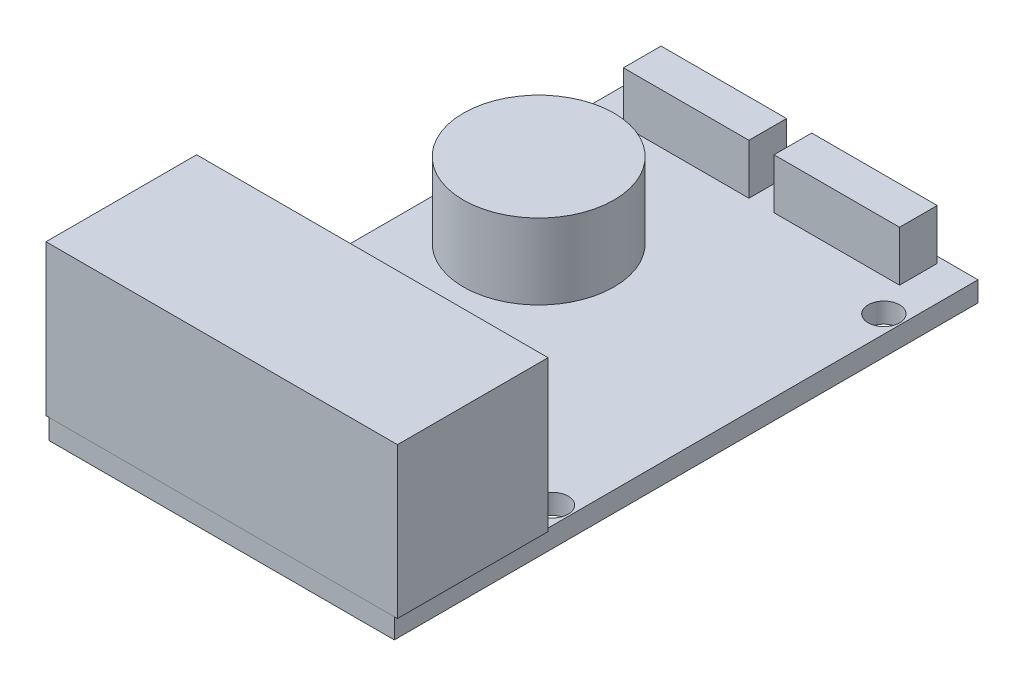
ISO-10303-21;
HEADER;
FILE_DESCRIPTION(('STEP AP214'),'2;1');
FILE_NAME('part.step','',(''),(''),'','','');
FILE_SCHEMA(('AUTOMOTIVE_DESIGN { 1 0 10303 214 1 1 1 1 }'));
ENDSEC;
DATA;
#1=APPLICATION_CONTEXT('core data for automotive mechanical design processes');
#2=APPLICATION_PROTOCOL_DEFINITION('international standard','automotive_design',2000,#1);
#3=PRODUCT_CONTEXT('',#1,'mechanical');
#4=PRODUCT('Part','Part','',(#3));
#5=PRODUCT_RELATED_PRODUCT_CATEGORY('part','',(#4));
#6=PRODUCT_DEFINITION_FORMATION('','',#4);
#7=PRODUCT_DEFINITION_CONTEXT('part definition',#1,'design');
#8=PRODUCT_DEFINITION('design','',#6,#7);
#9=PRODUCT_DEFINITION_SHAPE('','',#8);
#10=(LENGTH_UNIT() NAMED_UNIT(*) SI_UNIT(.MILLI.,.METRE.));
#11=(NAMED_UNIT(*) PLANE_ANGLE_UNIT() SI_UNIT($,.RADIAN.));
#12=(NAMED_UNIT(*) SI_UNIT($,.STERADIAN.) SOLID_ANGLE_UNIT());
#13=UNCERTAINTY_MEASURE_WITH_UNIT(LENGTH_MEASURE(1.E-05),#10,'distance_accuracy_value','');
#14=(GEOMETRIC_REPRESENTATION_CONTEXT(3) GLOBAL_UNCERTAINTY_ASSIGNED_CONTEXT((#13)) GLOBAL_UNIT_ASSIGNED_CONTEXT((#10,
#11,#12)) REPRESENTATION_CONTEXT('',''));
#15=CARTESIAN_POINT('',(0.,0.,0.));
#16=DIRECTION('',(0.,0.,1.));
#17=DIRECTION('',(1.,0.,0.));
#18=AXIS2_PLACEMENT_3D('',#15,#16,#17);
#19=CARTESIAN_POINT('',(-14.,13.6,11.25));
#20=DIRECTION('',(-1.,0.,0.));
#21=DIRECTION('',(0.,-1.,0.));
#22=AXIS2_PLACEMENT_3D('',#19,#20,#21);
#23=PLANE('',#22);
#24=DIRECTION('',(0.,-1.,0.));
#25=VECTOR('',#24,1.);
#26=CARTESIAN_POINT('',(-14.,13.6,23.25));
#27=LINE('',#26,#25);
#28=CARTESIAN_POINT('',(-14.,13.6,23.25));
#29=VERTEX_POINT('',#28);
#30=CARTESIAN_POINT('',(-14.,1.6,23.25));
#31=VERTEX_POINT('',#30);
#32=EDGE_CURVE('E122',#29,#31,#27,.T.);
#33=ORIENTED_EDGE('',*,*,#32,.F.);
#34=DIRECTION('',(0.,0.,1.));
#35=VECTOR('',#34,1.);
#36=CARTESIAN_POINT('',(-14.,13.6,11.25));
#37=LINE('',#36,#35);
#38=CARTESIAN_POINT('',(-14.,13.6,11.25));
#39=VERTEX_POINT('',#38);
#40=EDGE_CURVE('E12',#39,#29,#37,.T.);
#41=ORIENTED_EDGE('',*,*,#40,.F.);
#42=DIRECTION('',(0.,-1.,0.));
#43=VECTOR('',#42,1.);
#44=CARTESIAN_POINT('',(-14.,13.6,11.25));
#45=LINE('',#44,#43);
#46=CARTESIAN_POINT('',(-14.,1.6,11.25));
#47=VERTEX_POINT('',#46);
#48=EDGE_CURVE('E114',#39,#47,#45,.T.);
#49=ORIENTED_EDGE('',*,*,#48,.T.);
#50=DIRECTION('',(0.,0.,1.));
#51=VECTOR('',#50,1.);
#52=CARTESIAN_POINT('',(-14.,1.6,11.25));
#53=LINE('',#52,#51);
#54=EDGE_CURVE('E55',#47,#31,#53,.T.);
#55=ORIENTED_EDGE('',*,*,#54,.T.);
#56=EDGE_LOOP('',(#33,#41,#49,#55));
#57=FACE_BOUND('',#56,.T.);
#58=ADVANCED_FACE('F52',(#57),#23,.T.);
#59=CARTESIAN_POINT('',(-14.,13.6,11.25));
#60=DIRECTION('',(0.,1.,0.));
#61=DIRECTION('',(0.,0.,1.));
#62=AXIS2_PLACEMENT_3D('',#59,#60,#61);
#63=PLANE('',#62);
#64=DIRECTION('',(-1.,0.,0.));
#65=VECTOR('',#64,1.);
#66=CARTESIAN_POINT('',(-14.,13.6,23.25));
#67=LINE('',#66,#65);
#68=CARTESIAN_POINT('',(14.,13.6,23.25));
#69=VERTEX_POINT('',#68);
#70=EDGE_CURVE('E117',#69,#29,#67,.T.);
#71=ORIENTED_EDGE('',*,*,#70,.F.);
#72=DIRECTION('',(0.,0.,1.));
#73=VECTOR('',#72,1.);
#74=CARTESIAN_POINT('',(14.,13.6,11.25));
#75=LINE('',#74,#73);
#76=CARTESIAN_POINT('',(14.,13.6,11.25));
#77=VERTEX_POINT('',#76);
#78=EDGE_CURVE('E62',#77,#69,#75,.T.);
#79=ORIENTED_EDGE('',*,*,#78,.F.);
#80=DIRECTION('',(-1.,0.,0.));
#81=VECTOR('',#80,1.);
#82=CARTESIAN_POINT('',(-14.,13.6,11.25));
#83=LINE('',#82,#81);
#84=EDGE_CURVE('E109',#77,#39,#83,.T.);
#85=ORIENTED_EDGE('',*,*,#84,.T.);
#86=ORIENTED_EDGE('',*,*,#40,.T.);
#87=EDGE_LOOP('',(#71,#79,#85,#86));
#88=FACE_BOUND('',#87,.T.);
#89=ADVANCED_FACE('F138',(#88),#63,.T.);
#90=CARTESIAN_POINT('',(14.,13.6,11.25));
#91=DIRECTION('',(1.,0.,0.));
#92=DIRECTION('',(0.,1.,0.));
#93=AXIS2_PLACEMENT_3D('',#90,#91,#92);
#94=PLANE('',#93);
#95=DIRECTION('',(0.,1.,0.));
#96=VECTOR('',#95,1.);
#97=CARTESIAN_POINT('',(14.,13.6,23.25));
#98=LINE('',#97,#96);
#99=CARTESIAN_POINT('',(14.,1.6,23.25));
#100=VERTEX_POINT('',#99);
#101=EDGE_CURVE('E103',#100,#69,#98,.T.);
#102=ORIENTED_EDGE('',*,*,#101,.F.);
#103=DIRECTION('',(0.,0.,1.));
#104=VECTOR('',#103,1.);
#105=CARTESIAN_POINT('',(14.,1.6,11.25));
#106=LINE('',#105,#104);
#107=CARTESIAN_POINT('',(14.,1.6,11.25));
#108=VERTEX_POINT('',#107);
#109=EDGE_CURVE('E98',#108,#100,#106,.T.);
#110=ORIENTED_EDGE('',*,*,#109,.F.);
#111=DIRECTION('',(0.,1.,0.));
#112=VECTOR('',#111,1.);
#113=CARTESIAN_POINT('',(14.,13.6,11.25));
#114=LINE('',#113,#112);
#115=EDGE_CURVE('E101',#108,#77,#114,.T.);
#116=ORIENTED_EDGE('',*,*,#115,.T.);
#117=ORIENTED_EDGE('',*,*,#78,.T.);
#118=EDGE_LOOP('',(#102,#110,#116,#117));
#119=FACE_BOUND('',#118,.T.);
#120=ADVANCED_FACE('F100',(#119),#94,.T.);
#121=CARTESIAN_POINT('',(-14.,1.6,11.25));
#122=DIRECTION('',(0.,-1.,0.));
#123=DIRECTION('',(0.,0.,-1.));
#124=AXIS2_PLACEMENT_3D('',#121,#122,#123);
#125=PLANE('',#124);
#126=DIRECTION('',(1.,0.,0.));
#127=VECTOR('',#126,1.);
#128=CARTESIAN_POINT('',(-14.,1.6,23.25));
#129=LINE('',#128,#127);
#130=EDGE_CURVE('E126',#31,#100,#129,.T.);
#131=ORIENTED_EDGE('',*,*,#130,.F.);
#132=ORIENTED_EDGE('',*,*,#54,.F.);
#133=DIRECTION('',(1.,0.,0.));
#134=VECTOR('',#133,1.);
#135=CARTESIAN_POINT('',(-14.,1.6,11.25));
#136=LINE('',#135,#134);
#137=EDGE_CURVE('E108',#47,#108,#136,.T.);
#138=ORIENTED_EDGE('',*,*,#137,.T.);
#139=ORIENTED_EDGE('',*,*,#109,.T.);
#140=EDGE_LOOP('',(#131,#132,#138,#139));
#141=FACE_BOUND('',#140,.T.);
#142=ADVANCED_FACE('F112',(#141),#125,.T.);
#143=CARTESIAN_POINT('',(0.,0.,11.25));
#144=DIRECTION('',(0.,0.,1.));
#145=DIRECTION('',(1.,0.,0.));
#146=AXIS2_PLACEMENT_3D('',#143,#144,#145);
#147=PLANE('',#146);
#148=ORIENTED_EDGE('',*,*,#48,.F.);
#149=ORIENTED_EDGE('',*,*,#84,.F.);
#150=ORIENTED_EDGE('',*,*,#115,.F.);
#151=ORIENTED_EDGE('',*,*,#137,.F.);
#152=EDGE_LOOP('',(#148,#149,#150,#151));
#153=FACE_BOUND('',#152,.T.);
#154=ADVANCED_FACE('F107',(#153),#147,.F.);
#155=CARTESIAN_POINT('',(0.,0.,23.25));
#156=DIRECTION('',(0.,0.,1.));
#157=DIRECTION('',(1.,0.,0.));
#158=AXIS2_PLACEMENT_3D('',#155,#156,#157);
#159=PLANE('',#158);
#160=ORIENTED_EDGE('',*,*,#32,.T.);
#161=ORIENTED_EDGE('',*,*,#130,.T.);
#162=ORIENTED_EDGE('',*,*,#101,.T.);
#163=ORIENTED_EDGE('',*,*,#70,.T.);
#164=EDGE_LOOP('',(#160,#161,#162,#163));
#165=FACE_BOUND('',#164,.T.);
#166=ADVANCED_FACE('F137',(#165),#159,.T.);
#167=CLOSED_SHELL('',(#58,#89,#120,#142,#154,#166));
#168=MANIFOLD_SOLID_BREP('B2',#167);
#169=CARTESIAN_POINT('',(0.,1.6,0.));
#170=DIRECTION('',(0.,1.,0.));
#171=DIRECTION('',(0.,0.,1.));
#172=AXIS2_PLACEMENT_3D('',#169,#170,#171);
#173=PLANE('',#172);
#174=CARTESIAN_POINT('',(-6.25,1.6,-8.25));
#175=DIRECTION('',(0.,1.,0.));
#176=DIRECTION('',(0.,0.,1.));
#177=AXIS2_PLACEMENT_3D('',#174,#175,#176);
#178=CIRCLE('',#177,6.);
#179=CARTESIAN_POINT('',(-6.25,1.6,-2.25));
#180=VERTEX_POINT('',#179);
#181=EDGE_CURVE('E347',#180,#180,#178,.T.);
#182=ORIENTED_EDGE('',*,*,#181,.F.);
#183=EDGE_LOOP('',(#182));
#184=FACE_BOUND('',#183,.T.);
#185=CARTESIAN_POINT('',(12.35,1.6,-17.15));
#186=DIRECTION('',(0.,1.,0.));
#187=DIRECTION('',(0.,0.,-1.));
#188=AXIS2_PLACEMENT_3D('',#185,#186,#187);
#189=CIRCLE('',#188,1.25);
#190=CARTESIAN_POINT('',(12.35,1.6,-18.4));
#191=VERTEX_POINT('',#190);
#192=EDGE_CURVE('E367',#191,#191,#189,.T.);
#193=ORIENTED_EDGE('',*,*,#192,.F.);
#194=EDGE_LOOP('',(#193));
#195=FACE_BOUND('',#194,.T.);
#196=CARTESIAN_POINT('',(12.35,1.6,9.24999999999997));
#197=DIRECTION('',(0.,1.,0.));
#198=DIRECTION('',(0.,0.,-1.));
#199=AXIS2_PLACEMENT_3D('',#196,#197,#198);
#200=CIRCLE('',#199,1.25);
#201=CARTESIAN_POINT('',(12.35,1.6,7.99999999999997));
#202=VERTEX_POINT('',#201);
#203=EDGE_CURVE('E361',#202,#202,#200,.T.);
#204=ORIENTED_EDGE('',*,*,#203,.F.);
#205=EDGE_LOOP('',(#204));
#206=FACE_BOUND('',#205,.T.);
#207=CARTESIAN_POINT('',(-12.35,1.6,9.25));
#208=DIRECTION('',(0.,1.,0.));
#209=DIRECTION('',(0.,0.,1.));
#210=AXIS2_PLACEMENT_3D('',#207,#208,#209);
#211=CIRCLE('',#210,1.25);
#212=CARTESIAN_POINT('',(-12.35,1.6,10.5));
#213=VERTEX_POINT('',#212);
#214=EDGE_CURVE('E354',#213,#213,#211,.T.);
#215=ORIENTED_EDGE('',*,*,#214,.F.);
#216=EDGE_LOOP('',(#215));
#217=FACE_BOUND('',#216,.T.);
#218=CARTESIAN_POINT('',(-12.35,1.6,-17.15));
#219=DIRECTION('',(0.,1.,0.));
#220=DIRECTION('',(0.,0.,1.));
#221=AXIS2_PLACEMENT_3D('',#218,#219,#220);
#222=CIRCLE('',#221,1.25);
#223=CARTESIAN_POINT('',(-12.35,1.6,-15.9));
#224=VERTEX_POINT('',#223);
#225=EDGE_CURVE('E357',#224,#224,#222,.T.);
#226=ORIENTED_EDGE('',*,*,#225,.F.);
#227=EDGE_LOOP('',(#226));
#228=FACE_BOUND('',#227,.T.);
#229=DIRECTION('',(0.,0.,1.));
#230=VECTOR('',#229,1.);
#231=CARTESIAN_POINT('',(-13.75,1.6,-23.25));
#232=LINE('',#231,#230);
#233=CARTESIAN_POINT('',(-13.75,1.6,-23.25));
#234=VERTEX_POINT('',#233);
#235=CARTESIAN_POINT('',(-13.75,1.6,23.25));
#236=VERTEX_POINT('',#235);
#237=EDGE_CURVE('E378',#234,#236,#232,.T.);
#238=ORIENTED_EDGE('',*,*,#237,.T.);
#239=DIRECTION('',(1.,0.,0.));
#240=VECTOR('',#239,1.);
#241=CARTESIAN_POINT('',(-13.75,1.6,23.25));
#242=LINE('',#241,#240);
#243=CARTESIAN_POINT('',(13.75,1.6,23.25));
#244=VERTEX_POINT('',#243);
#245=EDGE_CURVE('E381',#236,#244,#242,.T.);
#246=ORIENTED_EDGE('',*,*,#245,.T.);
#247=DIRECTION('',(0.,0.,-1.));
#248=VECTOR('',#247,1.);
#249=CARTESIAN_POINT('',(13.75,1.6,-23.25));
#250=LINE('',#249,#248);
#251=CARTESIAN_POINT('',(13.75,1.6,-23.25));
#252=VERTEX_POINT('',#251);
#253=EDGE_CURVE('E384',#244,#252,#250,.T.);
#254=ORIENTED_EDGE('',*,*,#253,.T.);
#255=DIRECTION('',(-1.,0.,0.));
#256=VECTOR('',#255,1.);
#257=CARTESIAN_POINT('',(-13.75,1.6,-23.25));
#258=LINE('',#257,#256);
#259=EDGE_CURVE('E386',#252,#234,#258,.T.);
#260=ORIENTED_EDGE('',*,*,#259,.T.);
#261=EDGE_LOOP('',(#238,#246,#254,#260));
#262=FACE_BOUND('',#261,.T.);
#263=DIRECTION('',(1.,0.,0.));
#264=VECTOR('',#263,1.);
#265=CARTESIAN_POINT('',(-11.,1.6,-19.75));
#266=LINE('',#265,#264);
#267=CARTESIAN_POINT('',(-11.,1.6,-19.75));
#268=VERTEX_POINT('',#267);
#269=CARTESIAN_POINT('',(-1.,1.6,-19.75));
#270=VERTEX_POINT('',#269);
#271=EDGE_CURVE('E313',#268,#270,#266,.T.);
#272=ORIENTED_EDGE('',*,*,#271,.F.);
#273=DIRECTION('',(0.,0.,1.));
#274=VECTOR('',#273,1.);
#275=CARTESIAN_POINT('',(-11.,1.6,-22.75));
#276=LINE('',#275,#274);
#277=CARTESIAN_POINT('',(-11.,1.6,-22.75));
#278=VERTEX_POINT('',#277);
#279=EDGE_CURVE('E310',#278,#268,#276,.T.);
#280=ORIENTED_EDGE('',*,*,#279,.F.);
#281=DIRECTION('',(-1.,0.,0.));
#282=VECTOR('',#281,1.);
#283=CARTESIAN_POINT('',(-11.,1.6,-22.75));
#284=LINE('',#283,#282);
#285=CARTESIAN_POINT('',(-0.999999999999999,1.6,-22.75));
#286=VERTEX_POINT('',#285);
#287=EDGE_CURVE('E328',#286,#278,#284,.T.);
#288=ORIENTED_EDGE('',*,*,#287,.F.);
#289=DIRECTION('',(0.,0.,-1.));
#290=VECTOR('',#289,1.);
#291=CARTESIAN_POINT('',(-0.999999999999999,1.6,-22.75));
#292=LINE('',#291,#290);
#293=EDGE_CURVE('E336',#270,#286,#292,.T.);
#294=ORIENTED_EDGE('',*,*,#293,.F.);
#295=EDGE_LOOP('',(#272,#280,#288,#294));
#296=FACE_BOUND('',#295,.T.);
#297=DIRECTION('',(-1.,0.,0.));
#298=VECTOR('',#297,1.);
#299=CARTESIAN_POINT('',(11.,1.6,-22.75));
#300=LINE('',#299,#298);
#301=CARTESIAN_POINT('',(11.,1.6,-22.75));
#302=VERTEX_POINT('',#301);
#303=CARTESIAN_POINT('',(0.999999999999999,1.6,-22.75));
#304=VERTEX_POINT('',#303);
#305=EDGE_CURVE('E309',#302,#304,#300,.T.);
#306=ORIENTED_EDGE('',*,*,#305,.F.);
#307=DIRECTION('',(0.,0.,-1.));
#308=VECTOR('',#307,1.);
#309=CARTESIAN_POINT('',(11.,1.6,-22.75));
#310=LINE('',#309,#308);
#311=CARTESIAN_POINT('',(11.,1.6,-19.75));
#312=VERTEX_POINT('',#311);
#313=EDGE_CURVE('E304',#312,#302,#310,.T.);
#314=ORIENTED_EDGE('',*,*,#313,.F.);
#315=DIRECTION('',(1.,0.,0.));
#316=VECTOR('',#315,1.);
#317=CARTESIAN_POINT('',(11.,1.6,-19.75));
#318=LINE('',#317,#316);
#319=CARTESIAN_POINT('',(1.,1.6,-19.75));
#320=VERTEX_POINT('',#319);
#321=EDGE_CURVE('E289',#320,#312,#318,.T.);
#322=ORIENTED_EDGE('',*,*,#321,.F.);
#323=DIRECTION('',(0.,0.,1.));
#324=VECTOR('',#323,1.);
#325=CARTESIAN_POINT('',(0.999999999999999,1.6,-22.75));
#326=LINE('',#325,#324);
#327=EDGE_CURVE('E297',#304,#320,#326,.T.);
#328=ORIENTED_EDGE('',*,*,#327,.F.);
#329=EDGE_LOOP('',(#306,#314,#322,#328));
#330=FACE_BOUND('',#329,.T.);
#331=ADVANCED_FACE('F199',(#184,#195,#206,#217,#228,#262,#296,#330),#173,.T.);
#332=CARTESIAN_POINT('',(-13.75,1.6,-23.25));
#333=DIRECTION('',(1.,0.,0.));
#334=DIRECTION('',(0.,0.,-1.));
#335=AXIS2_PLACEMENT_3D('',#332,#333,#334);
#336=PLANE('',#335);
#337=DIRECTION('',(0.,0.,1.));
#338=VECTOR('',#337,1.);
#339=CARTESIAN_POINT('',(-13.75,0.,-23.25));
#340=LINE('',#339,#338);
#341=CARTESIAN_POINT('',(-13.75,0.,-23.25));
#342=VERTEX_POINT('',#341);
#343=CARTESIAN_POINT('',(-13.75,0.,23.25));
#344=VERTEX_POINT('',#343);
#345=EDGE_CURVE('E375',#342,#344,#340,.T.);
#346=ORIENTED_EDGE('',*,*,#345,.T.);
#347=DIRECTION('',(0.,-1.,0.));
#348=VECTOR('',#347,1.);
#349=CARTESIAN_POINT('',(-13.75,1.6,23.25));
#350=LINE('',#349,#348);
#351=EDGE_CURVE('E50',#236,#344,#350,.T.);
#352=ORIENTED_EDGE('',*,*,#351,.F.);
#353=ORIENTED_EDGE('',*,*,#237,.F.);
#354=DIRECTION('',(0.,-1.,0.));
#355=VECTOR('',#354,1.);
#356=CARTESIAN_POINT('',(-13.75,1.6,-23.25));
#357=LINE('',#356,#355);
#358=EDGE_CURVE('E388',#234,#342,#357,.T.);
#359=ORIENTED_EDGE('',*,*,#358,.T.);
#360=EDGE_LOOP('',(#346,#352,#353,#359));
#361=FACE_BOUND('',#360,.T.);
#362=ADVANCED_FACE('F201',(#361),#336,.F.);
#363=CARTESIAN_POINT('',(-13.75,1.6,23.25));
#364=DIRECTION('',(0.,0.,-1.));
#365=DIRECTION('',(-1.,0.,0.));
#366=AXIS2_PLACEMENT_3D('',#363,#364,#365);
#367=PLANE('',#366);
#368=DIRECTION('',(1.,0.,0.));
#369=VECTOR('',#368,1.);
#370=CARTESIAN_POINT('',(-13.75,0.,23.25));
#371=LINE('',#370,#369);
#372=CARTESIAN_POINT('',(13.75,0.,23.25));
#373=VERTEX_POINT('',#372);
#374=EDGE_CURVE('E391',#344,#373,#371,.T.);
#375=ORIENTED_EDGE('',*,*,#374,.T.);
#376=DIRECTION('',(0.,-1.,0.));
#377=VECTOR('',#376,1.);
#378=CARTESIAN_POINT('',(13.75,1.6,23.25));
#379=LINE('',#378,#377);
#380=EDGE_CURVE('E207',#244,#373,#379,.T.);
#381=ORIENTED_EDGE('',*,*,#380,.F.);
#382=ORIENTED_EDGE('',*,*,#245,.F.);
#383=ORIENTED_EDGE('',*,*,#351,.T.);
#384=EDGE_LOOP('',(#375,#381,#382,#383));
#385=FACE_BOUND('',#384,.T.);
#386=ADVANCED_FACE('F421',(#385),#367,.F.);
#387=CARTESIAN_POINT('',(13.75,1.6,-23.25));
#388=DIRECTION('',(-1.,0.,0.));
#389=DIRECTION('',(0.,0.,1.));
#390=AXIS2_PLACEMENT_3D('',#387,#388,#389);
#391=PLANE('',#390);
#392=DIRECTION('',(0.,0.,-1.));
#393=VECTOR('',#392,1.);
#394=CARTESIAN_POINT('',(13.75,0.,-23.25));
#395=LINE('',#394,#393);
#396=CARTESIAN_POINT('',(13.75,0.,-23.25));
#397=VERTEX_POINT('',#396);
#398=EDGE_CURVE('E393',#373,#397,#395,.T.);
#399=ORIENTED_EDGE('',*,*,#398,.T.);
#400=DIRECTION('',(0.,-1.,0.));
#401=VECTOR('',#400,1.);
#402=CARTESIAN_POINT('',(13.75,1.6,-23.25));
#403=LINE('',#402,#401);
#404=EDGE_CURVE('E398',#252,#397,#403,.T.);
#405=ORIENTED_EDGE('',*,*,#404,.F.);
#406=ORIENTED_EDGE('',*,*,#253,.F.);
#407=ORIENTED_EDGE('',*,*,#380,.T.);
#408=EDGE_LOOP('',(#399,#405,#406,#407));
#409=FACE_BOUND('',#408,.T.);
#410=ADVANCED_FACE('F405',(#409),#391,.F.);
#411=CARTESIAN_POINT('',(-13.75,1.6,-23.25));
#412=DIRECTION('',(0.,0.,1.));
#413=DIRECTION('',(1.,0.,0.));
#414=AXIS2_PLACEMENT_3D('',#411,#412,#413);
#415=PLANE('',#414);
#416=DIRECTION('',(-1.,0.,0.));
#417=VECTOR('',#416,1.);
#418=CARTESIAN_POINT('',(-13.75,0.,-23.25));
#419=LINE('',#418,#417);
#420=EDGE_CURVE('E382',#397,#342,#419,.T.);
#421=ORIENTED_EDGE('',*,*,#420,.T.);
#422=ORIENTED_EDGE('',*,*,#358,.F.);
#423=ORIENTED_EDGE('',*,*,#259,.F.);
#424=ORIENTED_EDGE('',*,*,#404,.T.);
#425=EDGE_LOOP('',(#421,#422,#423,#424));
#426=FACE_BOUND('',#425,.T.);
#427=ADVANCED_FACE('F414',(#426),#415,.F.);
#428=CARTESIAN_POINT('',(0.,0.,0.));
#429=DIRECTION('',(0.,1.,0.));
#430=DIRECTION('',(0.,0.,1.));
#431=AXIS2_PLACEMENT_3D('',#428,#429,#430);
#432=PLANE('',#431);
#433=CARTESIAN_POINT('',(12.35,0.,-17.15));
#434=DIRECTION('',(0.,1.,0.));
#435=DIRECTION('',(0.,0.,-1.));
#436=AXIS2_PLACEMENT_3D('',#433,#434,#435);
#437=CIRCLE('',#436,1.25);
#438=CARTESIAN_POINT('',(12.35,0.,-18.4));
#439=VERTEX_POINT('',#438);
#440=EDGE_CURVE('E351',#439,#439,#437,.T.);
#441=ORIENTED_EDGE('',*,*,#440,.T.);
#442=EDGE_LOOP('',(#441));
#443=FACE_BOUND('',#442,.T.);
#444=CARTESIAN_POINT('',(12.35,0.,9.24999999999997));
#445=DIRECTION('',(0.,1.,0.));
#446=DIRECTION('',(0.,0.,-1.));
#447=AXIS2_PLACEMENT_3D('',#444,#445,#446);
#448=CIRCLE('',#447,1.25);
#449=CARTESIAN_POINT('',(12.35,0.,7.99999999999997));
#450=VERTEX_POINT('',#449);
#451=EDGE_CURVE('E364',#450,#450,#448,.T.);
#452=ORIENTED_EDGE('',*,*,#451,.T.);
#453=EDGE_LOOP('',(#452));
#454=FACE_BOUND('',#453,.T.);
#455=CARTESIAN_POINT('',(-12.35,0.,9.25));
#456=DIRECTION('',(0.,1.,0.));
#457=DIRECTION('',(0.,0.,1.));
#458=AXIS2_PLACEMENT_3D('',#455,#456,#457);
#459=CIRCLE('',#458,1.25);
#460=CARTESIAN_POINT('',(-12.35,0.,10.5));
#461=VERTEX_POINT('',#460);
#462=EDGE_CURVE('E358',#461,#461,#459,.T.);
#463=ORIENTED_EDGE('',*,*,#462,.T.);
#464=EDGE_LOOP('',(#463));
#465=FACE_BOUND('',#464,.T.);
#466=CARTESIAN_POINT('',(-12.35,0.,-17.15));
#467=DIRECTION('',(0.,1.,0.));
#468=DIRECTION('',(0.,0.,1.));
#469=AXIS2_PLACEMENT_3D('',#466,#467,#468);
#470=CIRCLE('',#469,1.25);
#471=CARTESIAN_POINT('',(-12.35,0.,-15.9));
#472=VERTEX_POINT('',#471);
#473=EDGE_CURVE('E372',#472,#472,#470,.T.);
#474=ORIENTED_EDGE('',*,*,#473,.T.);
#475=EDGE_LOOP('',(#474));
#476=FACE_BOUND('',#475,.T.);
#477=ORIENTED_EDGE('',*,*,#345,.F.);
#478=ORIENTED_EDGE('',*,*,#420,.F.);
#479=ORIENTED_EDGE('',*,*,#398,.F.);
#480=ORIENTED_EDGE('',*,*,#374,.F.);
#481=EDGE_LOOP('',(#477,#478,#479,#480));
#482=FACE_BOUND('',#481,.T.);
#483=ADVANCED_FACE('F411',(#443,#454,#465,#476,#482),#432,.F.);
#484=CARTESIAN_POINT('',(-12.35,0.,-17.15));
#485=DIRECTION('',(0.,1.,0.));
#486=DIRECTION('',(0.,0.,1.));
#487=AXIS2_PLACEMENT_3D('',#484,#485,#486);
#488=CYLINDRICAL_SURFACE('',#487,1.25);
#489=ORIENTED_EDGE('',*,*,#473,.F.);
#490=EDGE_LOOP('',(#489));
#491=FACE_BOUND('',#490,.T.);
#492=ORIENTED_EDGE('',*,*,#225,.T.);
#493=EDGE_LOOP('',(#492));
#494=FACE_BOUND('',#493,.T.);
#495=ADVANCED_FACE('F439',(#491,#494),#488,.F.);
#496=CARTESIAN_POINT('',(-12.35,0.,9.25));
#497=DIRECTION('',(0.,1.,0.));
#498=DIRECTION('',(0.,0.,1.));
#499=AXIS2_PLACEMENT_3D('',#496,#497,#498);
#500=CYLINDRICAL_SURFACE('',#499,1.25);
#501=ORIENTED_EDGE('',*,*,#462,.F.);
#502=EDGE_LOOP('',(#501));
#503=FACE_BOUND('',#502,.T.);
#504=ORIENTED_EDGE('',*,*,#214,.T.);
#505=EDGE_LOOP('',(#504));
#506=FACE_BOUND('',#505,.T.);
#507=ADVANCED_FACE('F470',(#503,#506),#500,.F.);
#508=CARTESIAN_POINT('',(12.35,0.,9.24999999999997));
#509=DIRECTION('',(0.,1.,0.));
#510=DIRECTION('',(0.,0.,1.));
#511=AXIS2_PLACEMENT_3D('',#508,#509,#510);
#512=CYLINDRICAL_SURFACE('',#511,1.25);
#513=ORIENTED_EDGE('',*,*,#451,.F.);
#514=EDGE_LOOP('',(#513));
#515=FACE_BOUND('',#514,.T.);
#516=ORIENTED_EDGE('',*,*,#203,.T.);
#517=EDGE_LOOP('',(#516));
#518=FACE_BOUND('',#517,.T.);
#519=ADVANCED_FACE('F476',(#515,#518),#512,.F.);
#520=CARTESIAN_POINT('',(12.35,0.,-17.15));
#521=DIRECTION('',(0.,1.,0.));
#522=DIRECTION('',(0.,0.,1.));
#523=AXIS2_PLACEMENT_3D('',#520,#521,#522);
#524=CYLINDRICAL_SURFACE('',#523,1.25);
#525=ORIENTED_EDGE('',*,*,#440,.F.);
#526=EDGE_LOOP('',(#525));
#527=FACE_BOUND('',#526,.T.);
#528=ORIENTED_EDGE('',*,*,#192,.T.);
#529=EDGE_LOOP('',(#528));
#530=FACE_BOUND('',#529,.T.);
#531=ADVANCED_FACE('F484',(#527,#530),#524,.F.);
#532=CARTESIAN_POINT('',(-6.25,7.6,-8.25));
#533=DIRECTION('',(0.,-1.,0.));
#534=DIRECTION('',(0.,0.,-1.));
#535=AXIS2_PLACEMENT_3D('',#532,#533,#534);
#536=CYLINDRICAL_SURFACE('',#535,6.);
#537=CARTESIAN_POINT('',(-6.25,7.6,-8.25));
#538=DIRECTION('',(0.,1.,0.));
#539=DIRECTION('',(0.,0.,1.));
#540=AXIS2_PLACEMENT_3D('',#537,#538,#539);
#541=CIRCLE('',#540,6.);
#542=CARTESIAN_POINT('',(-6.25,7.6,-2.25));
#543=VERTEX_POINT('',#542);
#544=EDGE_CURVE('E348',#543,#543,#541,.T.);
#545=ORIENTED_EDGE('',*,*,#544,.F.);
#546=EDGE_LOOP('',(#545));
#547=FACE_BOUND('',#546,.T.);
#548=ORIENTED_EDGE('',*,*,#181,.T.);
#549=EDGE_LOOP('',(#548));
#550=FACE_BOUND('',#549,.T.);
#551=ADVANCED_FACE('F492',(#547,#550),#536,.T.);
#552=CARTESIAN_POINT('',(-6.25,7.6,-8.25));
#553=DIRECTION('',(0.,1.,0.));
#554=DIRECTION('',(0.,0.,1.));
#555=AXIS2_PLACEMENT_3D('',#552,#553,#554);
#556=PLANE('',#555);
#557=ORIENTED_EDGE('',*,*,#544,.T.);
#558=EDGE_LOOP('',(#557));
#559=FACE_BOUND('',#558,.T.);
#560=ADVANCED_FACE('F499',(#559),#556,.T.);
#561=CARTESIAN_POINT('',(-11.,5.6,-22.75));
#562=DIRECTION('',(1.,0.,0.));
#563=DIRECTION('',(0.,0.,-1.));
#564=AXIS2_PLACEMENT_3D('',#561,#562,#563);
#565=PLANE('',#564);
#566=ORIENTED_EDGE('',*,*,#279,.T.);
#567=DIRECTION('',(0.,-1.,0.));
#568=VECTOR('',#567,1.);
#569=CARTESIAN_POINT('',(-11.,5.6,-19.75));
#570=LINE('',#569,#568);
#571=CARTESIAN_POINT('',(-11.,5.6,-19.75));
#572=VERTEX_POINT('',#571);
#573=EDGE_CURVE('E345',#572,#268,#570,.T.);
#574=ORIENTED_EDGE('',*,*,#573,.F.);
#575=DIRECTION('',(0.,0.,1.));
#576=VECTOR('',#575,1.);
#577=CARTESIAN_POINT('',(-11.,5.6,-22.75));
#578=LINE('',#577,#576);
#579=CARTESIAN_POINT('',(-11.,5.6,-22.75));
#580=VERTEX_POINT('',#579);
#581=EDGE_CURVE('E324',#580,#572,#578,.T.);
#582=ORIENTED_EDGE('',*,*,#581,.F.);
#583=DIRECTION('',(0.,-1.,0.));
#584=VECTOR('',#583,1.);
#585=CARTESIAN_POINT('',(-11.,5.6,-22.75));
#586=LINE('',#585,#584);
#587=EDGE_CURVE('E333',#580,#278,#586,.T.);
#588=ORIENTED_EDGE('',*,*,#587,.T.);
#589=EDGE_LOOP('',(#566,#574,#582,#588));
#590=FACE_BOUND('',#589,.T.);
#591=ADVANCED_FACE('F506',(#590),#565,.F.);
#592=CARTESIAN_POINT('',(-11.,5.6,-19.75));
#593=DIRECTION('',(0.,0.,-1.));
#594=DIRECTION('',(-1.,0.,0.));
#595=AXIS2_PLACEMENT_3D('',#592,#593,#594);
#596=PLANE('',#595);
#597=ORIENTED_EDGE('',*,*,#271,.T.);
#598=DIRECTION('',(0.,-1.,0.));
#599=VECTOR('',#598,1.);
#600=CARTESIAN_POINT('',(-1.,5.6,-19.75));
#601=LINE('',#600,#599);
#602=CARTESIAN_POINT('',(-1.,5.6,-19.75));
#603=VERTEX_POINT('',#602);
#604=EDGE_CURVE('E342',#603,#270,#601,.T.);
#605=ORIENTED_EDGE('',*,*,#604,.F.);
#606=DIRECTION('',(1.,0.,0.));
#607=VECTOR('',#606,1.);
#608=CARTESIAN_POINT('',(-11.,5.6,-19.75));
#609=LINE('',#608,#607);
#610=EDGE_CURVE('E327',#572,#603,#609,.T.);
#611=ORIENTED_EDGE('',*,*,#610,.F.);
#612=ORIENTED_EDGE('',*,*,#573,.T.);
#613=EDGE_LOOP('',(#597,#605,#611,#612));
#614=FACE_BOUND('',#613,.T.);
#615=ADVANCED_FACE('F512',(#614),#596,.F.);
#616=CARTESIAN_POINT('',(-0.999999999999999,5.6,-22.75));
#617=DIRECTION('',(-1.,0.,0.));
#618=DIRECTION('',(0.,0.,1.));
#619=AXIS2_PLACEMENT_3D('',#616,#617,#618);
#620=PLANE('',#619);
#621=ORIENTED_EDGE('',*,*,#293,.T.);
#622=DIRECTION('',(0.,-1.,0.));
#623=VECTOR('',#622,1.);
#624=CARTESIAN_POINT('',(-0.999999999999999,5.6,-22.75));
#625=LINE('',#624,#623);
#626=CARTESIAN_POINT('',(-0.999999999999999,5.6,-22.75));
#627=VERTEX_POINT('',#626);
#628=EDGE_CURVE('E222',#627,#286,#625,.T.);
#629=ORIENTED_EDGE('',*,*,#628,.F.);
#630=DIRECTION('',(0.,0.,-1.));
#631=VECTOR('',#630,1.);
#632=CARTESIAN_POINT('',(-0.999999999999999,5.6,-22.75));
#633=LINE('',#632,#631);
#634=EDGE_CURVE('E330',#603,#627,#633,.T.);
#635=ORIENTED_EDGE('',*,*,#634,.F.);
#636=ORIENTED_EDGE('',*,*,#604,.T.);
#637=EDGE_LOOP('',(#621,#629,#635,#636));
#638=FACE_BOUND('',#637,.T.);
#639=ADVANCED_FACE('F519',(#638),#620,.F.);
#640=CARTESIAN_POINT('',(-11.,5.6,-22.75));
#641=DIRECTION('',(0.,0.,1.));
#642=DIRECTION('',(1.,0.,0.));
#643=AXIS2_PLACEMENT_3D('',#640,#641,#642);
#644=PLANE('',#643);
#645=ORIENTED_EDGE('',*,*,#287,.T.);
#646=ORIENTED_EDGE('',*,*,#587,.F.);
#647=DIRECTION('',(-1.,0.,0.));
#648=VECTOR('',#647,1.);
#649=CARTESIAN_POINT('',(-11.,5.6,-22.75));
#650=LINE('',#649,#648);
#651=EDGE_CURVE('E332',#627,#580,#650,.T.);
#652=ORIENTED_EDGE('',*,*,#651,.F.);
#653=ORIENTED_EDGE('',*,*,#628,.T.);
#654=EDGE_LOOP('',(#645,#646,#652,#653));
#655=FACE_BOUND('',#654,.T.);
#656=ADVANCED_FACE('F527',(#655),#644,.F.);
#657=CARTESIAN_POINT('',(0.,5.6,0.));
#658=DIRECTION('',(0.,1.,0.));
#659=DIRECTION('',(0.,0.,1.));
#660=AXIS2_PLACEMENT_3D('',#657,#658,#659);
#661=PLANE('',#660);
#662=ORIENTED_EDGE('',*,*,#581,.T.);
#663=ORIENTED_EDGE('',*,*,#610,.T.);
#664=ORIENTED_EDGE('',*,*,#634,.T.);
#665=ORIENTED_EDGE('',*,*,#651,.T.);
#666=EDGE_LOOP('',(#662,#663,#664,#665));
#667=FACE_BOUND('',#666,.T.);
#668=ADVANCED_FACE('F535',(#667),#661,.T.);
#669=CARTESIAN_POINT('',(11.,5.6,-22.75));
#670=DIRECTION('',(-1.,0.,0.));
#671=DIRECTION('',(0.,0.,1.));
#672=AXIS2_PLACEMENT_3D('',#669,#670,#671);
#673=PLANE('',#672);
#674=ORIENTED_EDGE('',*,*,#313,.T.);
#675=DIRECTION('',(0.,-1.,0.));
#676=VECTOR('',#675,1.);
#677=CARTESIAN_POINT('',(11.,5.6,-22.75));
#678=LINE('',#677,#676);
#679=CARTESIAN_POINT('',(11.,5.6,-22.75));
#680=VERTEX_POINT('',#679);
#681=EDGE_CURVE('E672',#680,#302,#678,.T.);
#682=ORIENTED_EDGE('',*,*,#681,.F.);
#683=DIRECTION('',(0.,0.,-1.));
#684=VECTOR('',#683,1.);
#685=CARTESIAN_POINT('',(11.,5.6,-22.75));
#686=LINE('',#685,#684);
#687=CARTESIAN_POINT('',(11.,5.6,-19.75));
#688=VERTEX_POINT('',#687);
#689=EDGE_CURVE('E298',#688,#680,#686,.T.);
#690=ORIENTED_EDGE('',*,*,#689,.F.);
#691=DIRECTION('',(0.,-1.,0.));
#692=VECTOR('',#691,1.);
#693=CARTESIAN_POINT('',(11.,5.6,-19.75));
#694=LINE('',#693,#692);
#695=EDGE_CURVE('E292',#688,#312,#694,.T.);
#696=ORIENTED_EDGE('',*,*,#695,.T.);
#697=EDGE_LOOP('',(#674,#682,#690,#696));
#698=FACE_BOUND('',#697,.T.);
#699=ADVANCED_FACE('F302',(#698),#673,.F.);
#700=CARTESIAN_POINT('',(11.,5.6,-22.75));
#701=DIRECTION('',(0.,0.,1.));
#702=DIRECTION('',(1.,0.,0.));
#703=AXIS2_PLACEMENT_3D('',#700,#701,#702);
#704=PLANE('',#703);
#705=ORIENTED_EDGE('',*,*,#305,.T.);
#706=DIRECTION('',(0.,-1.,0.));
#707=VECTOR('',#706,1.);
#708=CARTESIAN_POINT('',(0.999999999999999,5.6,-22.75));
#709=LINE('',#708,#707);
#710=CARTESIAN_POINT('',(0.999999999999999,5.6,-22.75));
#711=VERTEX_POINT('',#710);
#712=EDGE_CURVE('E673',#711,#304,#709,.T.);
#713=ORIENTED_EDGE('',*,*,#712,.F.);
#714=DIRECTION('',(-1.,0.,0.));
#715=VECTOR('',#714,1.);
#716=CARTESIAN_POINT('',(11.,5.6,-22.75));
#717=LINE('',#716,#715);
#718=EDGE_CURVE('E321',#680,#711,#717,.T.);
#719=ORIENTED_EDGE('',*,*,#718,.F.);
#720=ORIENTED_EDGE('',*,*,#681,.T.);
#721=EDGE_LOOP('',(#705,#713,#719,#720));
#722=FACE_BOUND('',#721,.T.);
#723=ADVANCED_FACE('F549',(#722),#704,.F.);
#724=CARTESIAN_POINT('',(0.999999999999999,5.6,-22.75));
#725=DIRECTION('',(1.,0.,0.));
#726=DIRECTION('',(0.,0.,-1.));
#727=AXIS2_PLACEMENT_3D('',#724,#725,#726);
#728=PLANE('',#727);
#729=ORIENTED_EDGE('',*,*,#327,.T.);
#730=DIRECTION('',(0.,-1.,0.));
#731=VECTOR('',#730,1.);
#732=CARTESIAN_POINT('',(1.,5.6,-19.75));
#733=LINE('',#732,#731);
#734=CARTESIAN_POINT('',(1.,5.6,-19.75));
#735=VERTEX_POINT('',#734);
#736=EDGE_CURVE('E214',#735,#320,#733,.T.);
#737=ORIENTED_EDGE('',*,*,#736,.F.);
#738=DIRECTION('',(0.,0.,1.));
#739=VECTOR('',#738,1.);
#740=CARTESIAN_POINT('',(0.999999999999999,5.6,-22.75));
#741=LINE('',#740,#739);
#742=EDGE_CURVE('E319',#711,#735,#741,.T.);
#743=ORIENTED_EDGE('',*,*,#742,.F.);
#744=ORIENTED_EDGE('',*,*,#712,.T.);
#745=EDGE_LOOP('',(#729,#737,#743,#744));
#746=FACE_BOUND('',#745,.T.);
#747=ADVANCED_FACE('F556',(#746),#728,.F.);
#748=CARTESIAN_POINT('',(11.,5.6,-19.75));
#749=DIRECTION('',(0.,0.,-1.));
#750=DIRECTION('',(-1.,0.,0.));
#751=AXIS2_PLACEMENT_3D('',#748,#749,#750);
#752=PLANE('',#751);
#753=ORIENTED_EDGE('',*,*,#321,.T.);
#754=ORIENTED_EDGE('',*,*,#695,.F.);
#755=DIRECTION('',(1.,0.,0.));
#756=VECTOR('',#755,1.);
#757=CARTESIAN_POINT('',(11.,5.6,-19.75));
#758=LINE('',#757,#756);
#759=EDGE_CURVE('E307',#735,#688,#758,.T.);
#760=ORIENTED_EDGE('',*,*,#759,.F.);
#761=ORIENTED_EDGE('',*,*,#736,.T.);
#762=EDGE_LOOP('',(#753,#754,#760,#761));
#763=FACE_BOUND('',#762,.T.);
#764=ADVANCED_FACE('F291',(#763),#752,.F.);
#765=CARTESIAN_POINT('',(0.,5.6,0.));
#766=DIRECTION('',(0.,-1.,0.));
#767=DIRECTION('',(0.,0.,-1.));
#768=AXIS2_PLACEMENT_3D('',#765,#766,#767);
#769=PLANE('',#768);
#770=ORIENTED_EDGE('',*,*,#689,.T.);
#771=ORIENTED_EDGE('',*,*,#718,.T.);
#772=ORIENTED_EDGE('',*,*,#742,.T.);
#773=ORIENTED_EDGE('',*,*,#759,.T.);
#774=EDGE_LOOP('',(#770,#771,#772,#773));
#775=FACE_BOUND('',#774,.T.);
#776=ADVANCED_FACE('F571',(#775),#769,.F.);
#777=CLOSED_SHELL('',(#331,#362,#386,#410,#427,#483,#495,#507,#519,#531,#551,#560,#591,#615,
#639,#656,#668,#699,#723,#747,#764,#776));
#778=MANIFOLD_SOLID_BREP('B6',#777);
#779=ADVANCED_BREP_SHAPE_REPRESENTATION('',(#18,#168,#778),#14);
#780=SHAPE_DEFINITION_REPRESENTATION(#9,#779);
ENDSEC;
END-ISO-10303-21;
